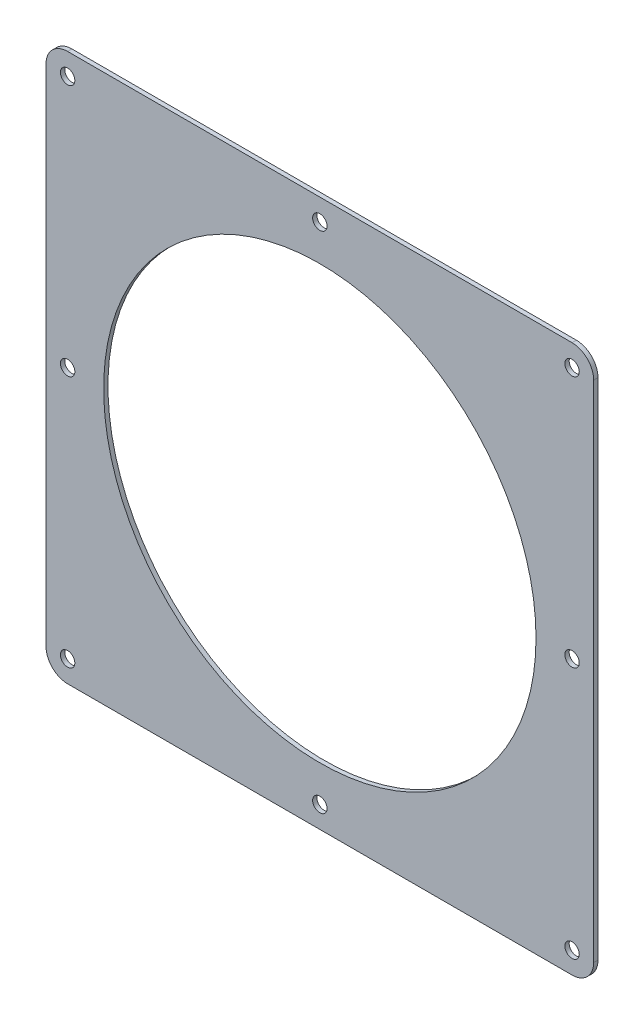
ISO-10303-21;
HEADER;
FILE_DESCRIPTION(('STEP AP214'),'2;1');
FILE_NAME('part.step','',(''),(''),'','','');
FILE_SCHEMA(('AUTOMOTIVE_DESIGN { 1 0 10303 214 1 1 1 1 }'));
ENDSEC;
DATA;
#1=APPLICATION_CONTEXT('core data for automotive mechanical design processes');
#2=APPLICATION_PROTOCOL_DEFINITION('international standard','automotive_design',2000,#1);
#3=PRODUCT_CONTEXT('',#1,'mechanical');
#4=PRODUCT('Part','Part','',(#3));
#5=PRODUCT_RELATED_PRODUCT_CATEGORY('part','',(#4));
#6=PRODUCT_DEFINITION_FORMATION('','',#4);
#7=PRODUCT_DEFINITION_CONTEXT('part definition',#1,'design');
#8=PRODUCT_DEFINITION('design','',#6,#7);
#9=PRODUCT_DEFINITION_SHAPE('','',#8);
#10=(LENGTH_UNIT() NAMED_UNIT(*) SI_UNIT(.MILLI.,.METRE.));
#11=(NAMED_UNIT(*) PLANE_ANGLE_UNIT() SI_UNIT($,.RADIAN.));
#12=(NAMED_UNIT(*) SI_UNIT($,.STERADIAN.) SOLID_ANGLE_UNIT());
#13=UNCERTAINTY_MEASURE_WITH_UNIT(LENGTH_MEASURE(1.E-05),#10,'distance_accuracy_value','');
#14=(GEOMETRIC_REPRESENTATION_CONTEXT(3) GLOBAL_UNCERTAINTY_ASSIGNED_CONTEXT((#13)) GLOBAL_UNIT_ASSIGNED_CONTEXT((#10,
#11,#12)) REPRESENTATION_CONTEXT('',''));
#15=CARTESIAN_POINT('',(0.,0.,0.));
#16=DIRECTION('',(0.,0.,1.));
#17=DIRECTION('',(1.,0.,0.));
#18=AXIS2_PLACEMENT_3D('',#15,#16,#17);
#19=CARTESIAN_POINT('',(-175.,-175.,3.));
#20=DIRECTION('',(0.,0.,1.));
#21=DIRECTION('',(1.,0.,0.));
#22=AXIS2_PLACEMENT_3D('',#19,#20,#21);
#23=PLANE('',#22);
#24=CARTESIAN_POINT('',(175.,-175.,3.));
#25=DIRECTION('',(0.,0.,1.));
#26=DIRECTION('',(1.,0.,0.));
#27=AXIS2_PLACEMENT_3D('',#24,#25,#26);
#28=CIRCLE('',#27,4.99999999999999);
#29=CARTESIAN_POINT('',(180.,-175.,3.));
#30=VERTEX_POINT('',#29);
#31=EDGE_CURVE('E218',#30,#30,#28,.T.);
#32=ORIENTED_EDGE('',*,*,#31,.F.);
#33=EDGE_LOOP('',(#32));
#34=FACE_BOUND('',#33,.T.);
#35=CARTESIAN_POINT('',(-175.,-175.,3.));
#36=DIRECTION('',(0.,0.,1.));
#37=DIRECTION('',(1.,0.,0.));
#38=AXIS2_PLACEMENT_3D('',#35,#36,#37);
#39=CIRCLE('',#38,4.99999999999999);
#40=CARTESIAN_POINT('',(-170.,-175.,3.));
#41=VERTEX_POINT('',#40);
#42=EDGE_CURVE('E206',#41,#41,#39,.T.);
#43=ORIENTED_EDGE('',*,*,#42,.F.);
#44=EDGE_LOOP('',(#43));
#45=FACE_BOUND('',#44,.T.);
#46=CARTESIAN_POINT('',(175.,0.,3.));
#47=DIRECTION('',(0.,0.,1.));
#48=DIRECTION('',(1.,0.,0.));
#49=AXIS2_PLACEMENT_3D('',#46,#47,#48);
#50=CIRCLE('',#49,5.00000000000002);
#51=CARTESIAN_POINT('',(180.,0.,3.));
#52=VERTEX_POINT('',#51);
#53=EDGE_CURVE('E194',#52,#52,#50,.T.);
#54=ORIENTED_EDGE('',*,*,#53,.F.);
#55=EDGE_LOOP('',(#54));
#56=FACE_BOUND('',#55,.T.);
#57=CARTESIAN_POINT('',(0.,175.,3.));
#58=DIRECTION('',(0.,0.,1.));
#59=DIRECTION('',(1.,0.,0.));
#60=AXIS2_PLACEMENT_3D('',#57,#58,#59);
#61=CIRCLE('',#60,5.00000000000001);
#62=CARTESIAN_POINT('',(5.00000000000001,175.,3.));
#63=VERTEX_POINT('',#62);
#64=EDGE_CURVE('E182',#63,#63,#61,.T.);
#65=ORIENTED_EDGE('',*,*,#64,.F.);
#66=EDGE_LOOP('',(#65));
#67=FACE_BOUND('',#66,.T.);
#68=CARTESIAN_POINT('',(-175.,-175.,3.));
#69=DIRECTION('',(0.,0.,1.));
#70=DIRECTION('',(1.,0.,0.));
#71=AXIS2_PLACEMENT_3D('',#68,#69,#70);
#72=CIRCLE('',#71,15.);
#73=CARTESIAN_POINT('',(-190.,-175.,3.));
#74=VERTEX_POINT('',#73);
#75=CARTESIAN_POINT('',(-175.,-190.,3.));
#76=VERTEX_POINT('',#75);
#77=EDGE_CURVE('E145',#74,#76,#72,.T.);
#78=ORIENTED_EDGE('',*,*,#77,.T.);
#79=DIRECTION('',(1.,0.,0.));
#80=VECTOR('',#79,1.);
#81=CARTESIAN_POINT('',(-175.,-190.,3.));
#82=LINE('',#81,#80);
#83=CARTESIAN_POINT('',(175.,-190.,3.));
#84=VERTEX_POINT('',#83);
#85=EDGE_CURVE('E93',#76,#84,#82,.T.);
#86=ORIENTED_EDGE('',*,*,#85,.T.);
#87=CARTESIAN_POINT('',(175.,-175.,3.));
#88=DIRECTION('',(0.,0.,1.));
#89=DIRECTION('',(1.,0.,0.));
#90=AXIS2_PLACEMENT_3D('',#87,#88,#89);
#91=CIRCLE('',#90,15.);
#92=CARTESIAN_POINT('',(190.,-175.,3.));
#93=VERTEX_POINT('',#92);
#94=EDGE_CURVE('E160',#84,#93,#91,.T.);
#95=ORIENTED_EDGE('',*,*,#94,.T.);
#96=DIRECTION('',(0.,1.,0.));
#97=VECTOR('',#96,1.);
#98=CARTESIAN_POINT('',(190.,175.,3.));
#99=LINE('',#98,#97);
#100=CARTESIAN_POINT('',(190.,175.,3.));
#101=VERTEX_POINT('',#100);
#102=EDGE_CURVE('E173',#93,#101,#99,.T.);
#103=ORIENTED_EDGE('',*,*,#102,.T.);
#104=CARTESIAN_POINT('',(175.,175.,3.));
#105=DIRECTION('',(0.,0.,1.));
#106=DIRECTION('',(-1.,0.,0.));
#107=AXIS2_PLACEMENT_3D('',#104,#105,#106);
#108=CIRCLE('',#107,15.);
#109=CARTESIAN_POINT('',(175.,190.,3.));
#110=VERTEX_POINT('',#109);
#111=EDGE_CURVE('E112',#101,#110,#108,.T.);
#112=ORIENTED_EDGE('',*,*,#111,.T.);
#113=DIRECTION('',(-1.,0.,0.));
#114=VECTOR('',#113,1.);
#115=CARTESIAN_POINT('',(-175.,190.,3.));
#116=LINE('',#115,#114);
#117=CARTESIAN_POINT('',(-175.,190.,3.));
#118=VERTEX_POINT('',#117);
#119=EDGE_CURVE('E106',#110,#118,#116,.T.);
#120=ORIENTED_EDGE('',*,*,#119,.T.);
#121=CARTESIAN_POINT('',(-175.,175.,3.));
#122=DIRECTION('',(0.,0.,1.));
#123=DIRECTION('',(1.,0.,0.));
#124=AXIS2_PLACEMENT_3D('',#121,#122,#123);
#125=CIRCLE('',#124,15.0000000000001);
#126=CARTESIAN_POINT('',(-190.,175.,3.));
#127=VERTEX_POINT('',#126);
#128=EDGE_CURVE('E110',#118,#127,#125,.T.);
#129=ORIENTED_EDGE('',*,*,#128,.T.);
#130=DIRECTION('',(0.,-1.,0.));
#131=VECTOR('',#130,1.);
#132=CARTESIAN_POINT('',(-190.,175.,3.));
#133=LINE('',#132,#131);
#134=EDGE_CURVE('E50',#127,#74,#133,.T.);
#135=ORIENTED_EDGE('',*,*,#134,.T.);
#136=EDGE_LOOP('',(#78,#86,#95,#103,#112,#120,#129,#135));
#137=FACE_BOUND('',#136,.T.);
#138=CARTESIAN_POINT('',(-175.,175.,3.));
#139=DIRECTION('',(0.,0.,1.));
#140=DIRECTION('',(1.,0.,0.));
#141=AXIS2_PLACEMENT_3D('',#138,#139,#140);
#142=CIRCLE('',#141,4.99999999999999);
#143=CARTESIAN_POINT('',(-170.,175.,3.));
#144=VERTEX_POINT('',#143);
#145=EDGE_CURVE('E134',#144,#144,#142,.T.);
#146=ORIENTED_EDGE('',*,*,#145,.F.);
#147=EDGE_LOOP('',(#146));
#148=FACE_BOUND('',#147,.T.);
#149=CARTESIAN_POINT('',(175.,175.,3.));
#150=DIRECTION('',(0.,0.,1.));
#151=DIRECTION('',(1.,0.,0.));
#152=AXIS2_PLACEMENT_3D('',#149,#150,#151);
#153=CIRCLE('',#152,4.99999999999999);
#154=CARTESIAN_POINT('',(180.,175.,3.));
#155=VERTEX_POINT('',#154);
#156=EDGE_CURVE('E188',#155,#155,#153,.T.);
#157=ORIENTED_EDGE('',*,*,#156,.F.);
#158=EDGE_LOOP('',(#157));
#159=FACE_BOUND('',#158,.T.);
#160=CARTESIAN_POINT('',(-175.,0.,3.));
#161=DIRECTION('',(0.,0.,1.));
#162=DIRECTION('',(1.,0.,0.));
#163=AXIS2_PLACEMENT_3D('',#160,#161,#162);
#164=CIRCLE('',#163,5.00000000000002);
#165=CARTESIAN_POINT('',(-170.,0.,3.));
#166=VERTEX_POINT('',#165);
#167=EDGE_CURVE('E200',#166,#166,#164,.T.);
#168=ORIENTED_EDGE('',*,*,#167,.F.);
#169=EDGE_LOOP('',(#168));
#170=FACE_BOUND('',#169,.T.);
#171=CARTESIAN_POINT('',(0.,-175.,3.));
#172=DIRECTION('',(0.,0.,1.));
#173=DIRECTION('',(1.,0.,0.));
#174=AXIS2_PLACEMENT_3D('',#171,#172,#173);
#175=CIRCLE('',#174,5.);
#176=CARTESIAN_POINT('',(5.,-175.,3.));
#177=VERTEX_POINT('',#176);
#178=EDGE_CURVE('E212',#177,#177,#175,.T.);
#179=ORIENTED_EDGE('',*,*,#178,.F.);
#180=EDGE_LOOP('',(#179));
#181=FACE_BOUND('',#180,.T.);
#182=CARTESIAN_POINT('',(0.,0.,3.));
#183=DIRECTION('',(0.,0.,1.));
#184=DIRECTION('',(1.,0.,0.));
#185=AXIS2_PLACEMENT_3D('',#182,#183,#184);
#186=CIRCLE('',#185,150.);
#187=CARTESIAN_POINT('',(150.,0.,3.));
#188=VERTEX_POINT('',#187);
#189=EDGE_CURVE('E224',#188,#188,#186,.T.);
#190=ORIENTED_EDGE('',*,*,#189,.F.);
#191=EDGE_LOOP('',(#190));
#192=FACE_BOUND('',#191,.T.);
#193=ADVANCED_FACE('F33',(#34,#45,#56,#67,#137,#148,#159,#170,#181,#192),#23,.T.);
#194=CARTESIAN_POINT('',(-175.,-175.,0.));
#195=DIRECTION('',(0.,0.,1.));
#196=DIRECTION('',(1.,0.,0.));
#197=AXIS2_PLACEMENT_3D('',#194,#195,#196);
#198=PLANE('',#197);
#199=CARTESIAN_POINT('',(-175.,-175.,0.));
#200=DIRECTION('',(0.,0.,1.));
#201=DIRECTION('',(1.,0.,0.));
#202=AXIS2_PLACEMENT_3D('',#199,#200,#201);
#203=CIRCLE('',#202,15.);
#204=CARTESIAN_POINT('',(-190.,-175.,0.));
#205=VERTEX_POINT('',#204);
#206=CARTESIAN_POINT('',(-175.,-190.,0.));
#207=VERTEX_POINT('',#206);
#208=EDGE_CURVE('E130',#205,#207,#203,.T.);
#209=ORIENTED_EDGE('',*,*,#208,.F.);
#210=DIRECTION('',(0.,-1.,0.));
#211=VECTOR('',#210,1.);
#212=CARTESIAN_POINT('',(-190.,175.,0.));
#213=LINE('',#212,#211);
#214=CARTESIAN_POINT('',(-190.,175.,0.));
#215=VERTEX_POINT('',#214);
#216=EDGE_CURVE('E85',#215,#205,#213,.T.);
#217=ORIENTED_EDGE('',*,*,#216,.F.);
#218=CARTESIAN_POINT('',(-175.,175.,0.));
#219=DIRECTION('',(0.,0.,1.));
#220=DIRECTION('',(1.,0.,0.));
#221=AXIS2_PLACEMENT_3D('',#218,#219,#220);
#222=CIRCLE('',#221,15.0000000000001);
#223=CARTESIAN_POINT('',(-175.,190.,0.));
#224=VERTEX_POINT('',#223);
#225=EDGE_CURVE('E79',#224,#215,#222,.T.);
#226=ORIENTED_EDGE('',*,*,#225,.F.);
#227=DIRECTION('',(-1.,0.,0.));
#228=VECTOR('',#227,1.);
#229=CARTESIAN_POINT('',(-175.,190.,0.));
#230=LINE('',#229,#228);
#231=CARTESIAN_POINT('',(175.,190.,0.));
#232=VERTEX_POINT('',#231);
#233=EDGE_CURVE('E120',#232,#224,#230,.T.);
#234=ORIENTED_EDGE('',*,*,#233,.F.);
#235=CARTESIAN_POINT('',(175.,175.,0.));
#236=DIRECTION('',(0.,0.,1.));
#237=DIRECTION('',(-1.,0.,0.));
#238=AXIS2_PLACEMENT_3D('',#235,#236,#237);
#239=CIRCLE('',#238,15.);
#240=CARTESIAN_POINT('',(190.,175.,0.));
#241=VERTEX_POINT('',#240);
#242=EDGE_CURVE('E140',#241,#232,#239,.T.);
#243=ORIENTED_EDGE('',*,*,#242,.F.);
#244=DIRECTION('',(0.,1.,0.));
#245=VECTOR('',#244,1.);
#246=CARTESIAN_POINT('',(190.,175.,0.));
#247=LINE('',#246,#245);
#248=CARTESIAN_POINT('',(190.,-175.,0.));
#249=VERTEX_POINT('',#248);
#250=EDGE_CURVE('E138',#249,#241,#247,.T.);
#251=ORIENTED_EDGE('',*,*,#250,.F.);
#252=CARTESIAN_POINT('',(175.,-175.,0.));
#253=DIRECTION('',(0.,0.,1.));
#254=DIRECTION('',(1.,0.,0.));
#255=AXIS2_PLACEMENT_3D('',#252,#253,#254);
#256=CIRCLE('',#255,15.);
#257=CARTESIAN_POINT('',(175.,-190.,0.));
#258=VERTEX_POINT('',#257);
#259=EDGE_CURVE('E136',#258,#249,#256,.T.);
#260=ORIENTED_EDGE('',*,*,#259,.F.);
#261=DIRECTION('',(1.,0.,0.));
#262=VECTOR('',#261,1.);
#263=CARTESIAN_POINT('',(-175.,-190.,0.));
#264=LINE('',#263,#262);
#265=EDGE_CURVE('E133',#207,#258,#264,.T.);
#266=ORIENTED_EDGE('',*,*,#265,.F.);
#267=EDGE_LOOP('',(#209,#217,#226,#234,#243,#251,#260,#266));
#268=FACE_BOUND('',#267,.T.);
#269=CARTESIAN_POINT('',(-175.,175.,0.));
#270=DIRECTION('',(0.,0.,1.));
#271=DIRECTION('',(1.,0.,0.));
#272=AXIS2_PLACEMENT_3D('',#269,#270,#271);
#273=CIRCLE('',#272,4.99999999999999);
#274=CARTESIAN_POINT('',(-170.,175.,0.));
#275=VERTEX_POINT('',#274);
#276=EDGE_CURVE('E179',#275,#275,#273,.T.);
#277=ORIENTED_EDGE('',*,*,#276,.T.);
#278=EDGE_LOOP('',(#277));
#279=FACE_BOUND('',#278,.T.);
#280=CARTESIAN_POINT('',(0.,175.,0.));
#281=DIRECTION('',(0.,0.,1.));
#282=DIRECTION('',(1.,0.,0.));
#283=AXIS2_PLACEMENT_3D('',#280,#281,#282);
#284=CIRCLE('',#283,5.00000000000001);
#285=CARTESIAN_POINT('',(5.00000000000001,175.,0.));
#286=VERTEX_POINT('',#285);
#287=EDGE_CURVE('E185',#286,#286,#284,.T.);
#288=ORIENTED_EDGE('',*,*,#287,.T.);
#289=EDGE_LOOP('',(#288));
#290=FACE_BOUND('',#289,.T.);
#291=CARTESIAN_POINT('',(175.,175.,0.));
#292=DIRECTION('',(0.,0.,1.));
#293=DIRECTION('',(1.,0.,0.));
#294=AXIS2_PLACEMENT_3D('',#291,#292,#293);
#295=CIRCLE('',#294,4.99999999999999);
#296=CARTESIAN_POINT('',(180.,175.,0.));
#297=VERTEX_POINT('',#296);
#298=EDGE_CURVE('E191',#297,#297,#295,.T.);
#299=ORIENTED_EDGE('',*,*,#298,.T.);
#300=EDGE_LOOP('',(#299));
#301=FACE_BOUND('',#300,.T.);
#302=CARTESIAN_POINT('',(175.,0.,0.));
#303=DIRECTION('',(0.,0.,1.));
#304=DIRECTION('',(1.,0.,0.));
#305=AXIS2_PLACEMENT_3D('',#302,#303,#304);
#306=CIRCLE('',#305,5.00000000000002);
#307=CARTESIAN_POINT('',(180.,0.,0.));
#308=VERTEX_POINT('',#307);
#309=EDGE_CURVE('E197',#308,#308,#306,.T.);
#310=ORIENTED_EDGE('',*,*,#309,.T.);
#311=EDGE_LOOP('',(#310));
#312=FACE_BOUND('',#311,.T.);
#313=CARTESIAN_POINT('',(-175.,0.,0.));
#314=DIRECTION('',(0.,0.,1.));
#315=DIRECTION('',(1.,0.,0.));
#316=AXIS2_PLACEMENT_3D('',#313,#314,#315);
#317=CIRCLE('',#316,5.00000000000002);
#318=CARTESIAN_POINT('',(-170.,0.,0.));
#319=VERTEX_POINT('',#318);
#320=EDGE_CURVE('E203',#319,#319,#317,.T.);
#321=ORIENTED_EDGE('',*,*,#320,.T.);
#322=EDGE_LOOP('',(#321));
#323=FACE_BOUND('',#322,.T.);
#324=CARTESIAN_POINT('',(-175.,-175.,0.));
#325=DIRECTION('',(0.,0.,1.));
#326=DIRECTION('',(1.,0.,0.));
#327=AXIS2_PLACEMENT_3D('',#324,#325,#326);
#328=CIRCLE('',#327,4.99999999999999);
#329=CARTESIAN_POINT('',(-170.,-175.,0.));
#330=VERTEX_POINT('',#329);
#331=EDGE_CURVE('E209',#330,#330,#328,.T.);
#332=ORIENTED_EDGE('',*,*,#331,.T.);
#333=EDGE_LOOP('',(#332));
#334=FACE_BOUND('',#333,.T.);
#335=CARTESIAN_POINT('',(0.,-175.,0.));
#336=DIRECTION('',(0.,0.,1.));
#337=DIRECTION('',(1.,0.,0.));
#338=AXIS2_PLACEMENT_3D('',#335,#336,#337);
#339=CIRCLE('',#338,5.);
#340=CARTESIAN_POINT('',(5.,-175.,0.));
#341=VERTEX_POINT('',#340);
#342=EDGE_CURVE('E215',#341,#341,#339,.T.);
#343=ORIENTED_EDGE('',*,*,#342,.T.);
#344=EDGE_LOOP('',(#343));
#345=FACE_BOUND('',#344,.T.);
#346=CARTESIAN_POINT('',(175.,-175.,0.));
#347=DIRECTION('',(0.,0.,1.));
#348=DIRECTION('',(1.,0.,0.));
#349=AXIS2_PLACEMENT_3D('',#346,#347,#348);
#350=CIRCLE('',#349,4.99999999999999);
#351=CARTESIAN_POINT('',(180.,-175.,0.));
#352=VERTEX_POINT('',#351);
#353=EDGE_CURVE('E221',#352,#352,#350,.T.);
#354=ORIENTED_EDGE('',*,*,#353,.T.);
#355=EDGE_LOOP('',(#354));
#356=FACE_BOUND('',#355,.T.);
#357=CARTESIAN_POINT('',(0.,0.,0.));
#358=DIRECTION('',(0.,0.,1.));
#359=DIRECTION('',(1.,0.,0.));
#360=AXIS2_PLACEMENT_3D('',#357,#358,#359);
#361=CIRCLE('',#360,150.);
#362=CARTESIAN_POINT('',(150.,0.,0.));
#363=VERTEX_POINT('',#362);
#364=EDGE_CURVE('E227',#363,#363,#361,.T.);
#365=ORIENTED_EDGE('',*,*,#364,.T.);
#366=EDGE_LOOP('',(#365));
#367=FACE_BOUND('',#366,.T.);
#368=ADVANCED_FACE('F164',(#268,#279,#290,#301,#312,#323,#334,#345,#356,#367),#198,.F.);
#369=CARTESIAN_POINT('',(-175.,-175.,3.));
#370=DIRECTION('',(0.,0.,-1.));
#371=DIRECTION('',(-1.,0.,0.));
#372=AXIS2_PLACEMENT_3D('',#369,#370,#371);
#373=CYLINDRICAL_SURFACE('',#372,15.);
#374=ORIENTED_EDGE('',*,*,#208,.T.);
#375=DIRECTION('',(0.,0.,-1.));
#376=VECTOR('',#375,1.);
#377=CARTESIAN_POINT('',(-175.,-190.,3.));
#378=LINE('',#377,#376);
#379=EDGE_CURVE('E11',#76,#207,#378,.T.);
#380=ORIENTED_EDGE('',*,*,#379,.F.);
#381=ORIENTED_EDGE('',*,*,#77,.F.);
#382=DIRECTION('',(0.,0.,-1.));
#383=VECTOR('',#382,1.);
#384=CARTESIAN_POINT('',(-190.,-175.,3.));
#385=LINE('',#384,#383);
#386=EDGE_CURVE('E126',#74,#205,#385,.T.);
#387=ORIENTED_EDGE('',*,*,#386,.T.);
#388=EDGE_LOOP('',(#374,#380,#381,#387));
#389=FACE_BOUND('',#388,.T.);
#390=ADVANCED_FACE('F35',(#389),#373,.T.);
#391=CARTESIAN_POINT('',(-175.,-190.,3.));
#392=DIRECTION('',(0.,1.,0.));
#393=DIRECTION('',(0.,0.,1.));
#394=AXIS2_PLACEMENT_3D('',#391,#392,#393);
#395=PLANE('',#394);
#396=ORIENTED_EDGE('',*,*,#265,.T.);
#397=DIRECTION('',(0.,0.,-1.));
#398=VECTOR('',#397,1.);
#399=CARTESIAN_POINT('',(175.,-190.,3.));
#400=LINE('',#399,#398);
#401=EDGE_CURVE('E42',#84,#258,#400,.T.);
#402=ORIENTED_EDGE('',*,*,#401,.F.);
#403=ORIENTED_EDGE('',*,*,#85,.F.);
#404=ORIENTED_EDGE('',*,*,#379,.T.);
#405=EDGE_LOOP('',(#396,#402,#403,#404));
#406=FACE_BOUND('',#405,.T.);
#407=ADVANCED_FACE('F261',(#406),#395,.F.);
#408=CARTESIAN_POINT('',(175.,-175.,3.));
#409=DIRECTION('',(0.,0.,-1.));
#410=DIRECTION('',(-1.,0.,0.));
#411=AXIS2_PLACEMENT_3D('',#408,#409,#410);
#412=CYLINDRICAL_SURFACE('',#411,15.);
#413=ORIENTED_EDGE('',*,*,#259,.T.);
#414=DIRECTION('',(0.,0.,-1.));
#415=VECTOR('',#414,1.);
#416=CARTESIAN_POINT('',(190.,-175.,3.));
#417=LINE('',#416,#415);
#418=EDGE_CURVE('E152',#93,#249,#417,.T.);
#419=ORIENTED_EDGE('',*,*,#418,.F.);
#420=ORIENTED_EDGE('',*,*,#94,.F.);
#421=ORIENTED_EDGE('',*,*,#401,.T.);
#422=EDGE_LOOP('',(#413,#419,#420,#421));
#423=FACE_BOUND('',#422,.T.);
#424=ADVANCED_FACE('F158',(#423),#412,.T.);
#425=CARTESIAN_POINT('',(190.,175.,3.));
#426=DIRECTION('',(-1.,0.,0.));
#427=DIRECTION('',(0.,-1.,0.));
#428=AXIS2_PLACEMENT_3D('',#425,#426,#427);
#429=PLANE('',#428);
#430=ORIENTED_EDGE('',*,*,#250,.T.);
#431=DIRECTION('',(0.,0.,-1.));
#432=VECTOR('',#431,1.);
#433=CARTESIAN_POINT('',(190.,175.,3.));
#434=LINE('',#433,#432);
#435=EDGE_CURVE('E149',#101,#241,#434,.T.);
#436=ORIENTED_EDGE('',*,*,#435,.F.);
#437=ORIENTED_EDGE('',*,*,#102,.F.);
#438=ORIENTED_EDGE('',*,*,#418,.T.);
#439=EDGE_LOOP('',(#430,#436,#437,#438));
#440=FACE_BOUND('',#439,.T.);
#441=ADVANCED_FACE('F169',(#440),#429,.F.);
#442=CARTESIAN_POINT('',(175.,175.,3.));
#443=DIRECTION('',(0.,0.,-1.));
#444=DIRECTION('',(-1.,0.,0.));
#445=AXIS2_PLACEMENT_3D('',#442,#443,#444);
#446=CYLINDRICAL_SURFACE('',#445,15.);
#447=ORIENTED_EDGE('',*,*,#242,.T.);
#448=DIRECTION('',(0.,0.,-1.));
#449=VECTOR('',#448,1.);
#450=CARTESIAN_POINT('',(175.,190.,3.));
#451=LINE('',#450,#449);
#452=EDGE_CURVE('E121',#110,#232,#451,.T.);
#453=ORIENTED_EDGE('',*,*,#452,.F.);
#454=ORIENTED_EDGE('',*,*,#111,.F.);
#455=ORIENTED_EDGE('',*,*,#435,.T.);
#456=EDGE_LOOP('',(#447,#453,#454,#455));
#457=FACE_BOUND('',#456,.T.);
#458=ADVANCED_FACE('F172',(#457),#446,.T.);
#459=CARTESIAN_POINT('',(-175.,190.,3.));
#460=DIRECTION('',(0.,-1.,0.));
#461=DIRECTION('',(0.,0.,-1.));
#462=AXIS2_PLACEMENT_3D('',#459,#460,#461);
#463=PLANE('',#462);
#464=ORIENTED_EDGE('',*,*,#233,.T.);
#465=DIRECTION('',(0.,0.,-1.));
#466=VECTOR('',#465,1.);
#467=CARTESIAN_POINT('',(-175.,190.,3.));
#468=LINE('',#467,#466);
#469=EDGE_CURVE('E117',#118,#224,#468,.T.);
#470=ORIENTED_EDGE('',*,*,#469,.F.);
#471=ORIENTED_EDGE('',*,*,#119,.F.);
#472=ORIENTED_EDGE('',*,*,#452,.T.);
#473=EDGE_LOOP('',(#464,#470,#471,#472));
#474=FACE_BOUND('',#473,.T.);
#475=ADVANCED_FACE('F118',(#474),#463,.F.);
#476=CARTESIAN_POINT('',(-175.,175.,3.));
#477=DIRECTION('',(0.,0.,-1.));
#478=DIRECTION('',(-1.,0.,0.));
#479=AXIS2_PLACEMENT_3D('',#476,#477,#478);
#480=CYLINDRICAL_SURFACE('',#479,15.0000000000001);
#481=ORIENTED_EDGE('',*,*,#225,.T.);
#482=DIRECTION('',(0.,0.,-1.));
#483=VECTOR('',#482,1.);
#484=CARTESIAN_POINT('',(-190.,175.,3.));
#485=LINE('',#484,#483);
#486=EDGE_CURVE('E122',#127,#215,#485,.T.);
#487=ORIENTED_EDGE('',*,*,#486,.F.);
#488=ORIENTED_EDGE('',*,*,#128,.F.);
#489=ORIENTED_EDGE('',*,*,#469,.T.);
#490=EDGE_LOOP('',(#481,#487,#488,#489));
#491=FACE_BOUND('',#490,.T.);
#492=ADVANCED_FACE('F124',(#491),#480,.T.);
#493=CARTESIAN_POINT('',(-190.,175.,3.));
#494=DIRECTION('',(1.,0.,0.));
#495=DIRECTION('',(0.,1.,0.));
#496=AXIS2_PLACEMENT_3D('',#493,#494,#495);
#497=PLANE('',#496);
#498=ORIENTED_EDGE('',*,*,#216,.T.);
#499=ORIENTED_EDGE('',*,*,#386,.F.);
#500=ORIENTED_EDGE('',*,*,#134,.F.);
#501=ORIENTED_EDGE('',*,*,#486,.T.);
#502=EDGE_LOOP('',(#498,#499,#500,#501));
#503=FACE_BOUND('',#502,.T.);
#504=ADVANCED_FACE('F249',(#503),#497,.F.);
#505=CARTESIAN_POINT('',(-175.,175.,3.));
#506=DIRECTION('',(0.,0.,-1.));
#507=DIRECTION('',(-1.,0.,0.));
#508=AXIS2_PLACEMENT_3D('',#505,#506,#507);
#509=CYLINDRICAL_SURFACE('',#508,4.99999999999999);
#510=ORIENTED_EDGE('',*,*,#145,.T.);
#511=EDGE_LOOP('',(#510));
#512=FACE_BOUND('',#511,.T.);
#513=ORIENTED_EDGE('',*,*,#276,.F.);
#514=EDGE_LOOP('',(#513));
#515=FACE_BOUND('',#514,.T.);
#516=ADVANCED_FACE('F246',(#512,#515),#509,.F.);
#517=CARTESIAN_POINT('',(0.,175.,3.));
#518=DIRECTION('',(0.,0.,-1.));
#519=DIRECTION('',(-1.,0.,0.));
#520=AXIS2_PLACEMENT_3D('',#517,#518,#519);
#521=CYLINDRICAL_SURFACE('',#520,5.00000000000001);
#522=ORIENTED_EDGE('',*,*,#64,.T.);
#523=EDGE_LOOP('',(#522));
#524=FACE_BOUND('',#523,.T.);
#525=ORIENTED_EDGE('',*,*,#287,.F.);
#526=EDGE_LOOP('',(#525));
#527=FACE_BOUND('',#526,.T.);
#528=ADVANCED_FACE('F325',(#524,#527),#521,.F.);
#529=CARTESIAN_POINT('',(175.,175.,3.));
#530=DIRECTION('',(0.,0.,-1.));
#531=DIRECTION('',(-1.,0.,0.));
#532=AXIS2_PLACEMENT_3D('',#529,#530,#531);
#533=CYLINDRICAL_SURFACE('',#532,4.99999999999999);
#534=ORIENTED_EDGE('',*,*,#156,.T.);
#535=EDGE_LOOP('',(#534));
#536=FACE_BOUND('',#535,.T.);
#537=ORIENTED_EDGE('',*,*,#298,.F.);
#538=EDGE_LOOP('',(#537));
#539=FACE_BOUND('',#538,.T.);
#540=ADVANCED_FACE('F333',(#536,#539),#533,.F.);
#541=CARTESIAN_POINT('',(175.,0.,3.));
#542=DIRECTION('',(0.,0.,-1.));
#543=DIRECTION('',(-1.,0.,0.));
#544=AXIS2_PLACEMENT_3D('',#541,#542,#543);
#545=CYLINDRICAL_SURFACE('',#544,5.00000000000002);
#546=ORIENTED_EDGE('',*,*,#53,.T.);
#547=EDGE_LOOP('',(#546));
#548=FACE_BOUND('',#547,.T.);
#549=ORIENTED_EDGE('',*,*,#309,.F.);
#550=EDGE_LOOP('',(#549));
#551=FACE_BOUND('',#550,.T.);
#552=ADVANCED_FACE('F341',(#548,#551),#545,.F.);
#553=CARTESIAN_POINT('',(-175.,0.,3.));
#554=DIRECTION('',(0.,0.,-1.));
#555=DIRECTION('',(-1.,0.,0.));
#556=AXIS2_PLACEMENT_3D('',#553,#554,#555);
#557=CYLINDRICAL_SURFACE('',#556,5.00000000000002);
#558=ORIENTED_EDGE('',*,*,#167,.T.);
#559=EDGE_LOOP('',(#558));
#560=FACE_BOUND('',#559,.T.);
#561=ORIENTED_EDGE('',*,*,#320,.F.);
#562=EDGE_LOOP('',(#561));
#563=FACE_BOUND('',#562,.T.);
#564=ADVANCED_FACE('F350',(#560,#563),#557,.F.);
#565=CARTESIAN_POINT('',(-175.,-175.,3.));
#566=DIRECTION('',(0.,0.,-1.));
#567=DIRECTION('',(-1.,0.,0.));
#568=AXIS2_PLACEMENT_3D('',#565,#566,#567);
#569=CYLINDRICAL_SURFACE('',#568,4.99999999999999);
#570=ORIENTED_EDGE('',*,*,#42,.T.);
#571=EDGE_LOOP('',(#570));
#572=FACE_BOUND('',#571,.T.);
#573=ORIENTED_EDGE('',*,*,#331,.F.);
#574=EDGE_LOOP('',(#573));
#575=FACE_BOUND('',#574,.T.);
#576=ADVANCED_FACE('F359',(#572,#575),#569,.F.);
#577=CARTESIAN_POINT('',(0.,-175.,3.));
#578=DIRECTION('',(0.,0.,-1.));
#579=DIRECTION('',(-1.,0.,0.));
#580=AXIS2_PLACEMENT_3D('',#577,#578,#579);
#581=CYLINDRICAL_SURFACE('',#580,5.);
#582=ORIENTED_EDGE('',*,*,#178,.T.);
#583=EDGE_LOOP('',(#582));
#584=FACE_BOUND('',#583,.T.);
#585=ORIENTED_EDGE('',*,*,#342,.F.);
#586=EDGE_LOOP('',(#585));
#587=FACE_BOUND('',#586,.T.);
#588=ADVANCED_FACE('F368',(#584,#587),#581,.F.);
#589=CARTESIAN_POINT('',(175.,-175.,3.));
#590=DIRECTION('',(0.,0.,-1.));
#591=DIRECTION('',(-1.,0.,0.));
#592=AXIS2_PLACEMENT_3D('',#589,#590,#591);
#593=CYLINDRICAL_SURFACE('',#592,4.99999999999999);
#594=ORIENTED_EDGE('',*,*,#31,.T.);
#595=EDGE_LOOP('',(#594));
#596=FACE_BOUND('',#595,.T.);
#597=ORIENTED_EDGE('',*,*,#353,.F.);
#598=EDGE_LOOP('',(#597));
#599=FACE_BOUND('',#598,.T.);
#600=ADVANCED_FACE('F377',(#596,#599),#593,.F.);
#601=CARTESIAN_POINT('',(0.,0.,3.));
#602=DIRECTION('',(0.,0.,-1.));
#603=DIRECTION('',(-1.,0.,0.));
#604=AXIS2_PLACEMENT_3D('',#601,#602,#603);
#605=CYLINDRICAL_SURFACE('',#604,150.);
#606=ORIENTED_EDGE('',*,*,#189,.T.);
#607=EDGE_LOOP('',(#606));
#608=FACE_BOUND('',#607,.T.);
#609=ORIENTED_EDGE('',*,*,#364,.F.);
#610=EDGE_LOOP('',(#609));
#611=FACE_BOUND('',#610,.T.);
#612=ADVANCED_FACE('F233',(#608,#611),#605,.F.);
#613=CLOSED_SHELL('',(#193,#368,#390,#407,#424,#441,#458,#475,#492,#504,#516,#528,#540,#552,
#564,#576,#588,#600,#612));
#614=MANIFOLD_SOLID_BREP('B2',#613);
#615=ADVANCED_BREP_SHAPE_REPRESENTATION('',(#18,#614),#14);
#616=SHAPE_DEFINITION_REPRESENTATION(#9,#615);
ENDSEC;
END-ISO-10303-21;
